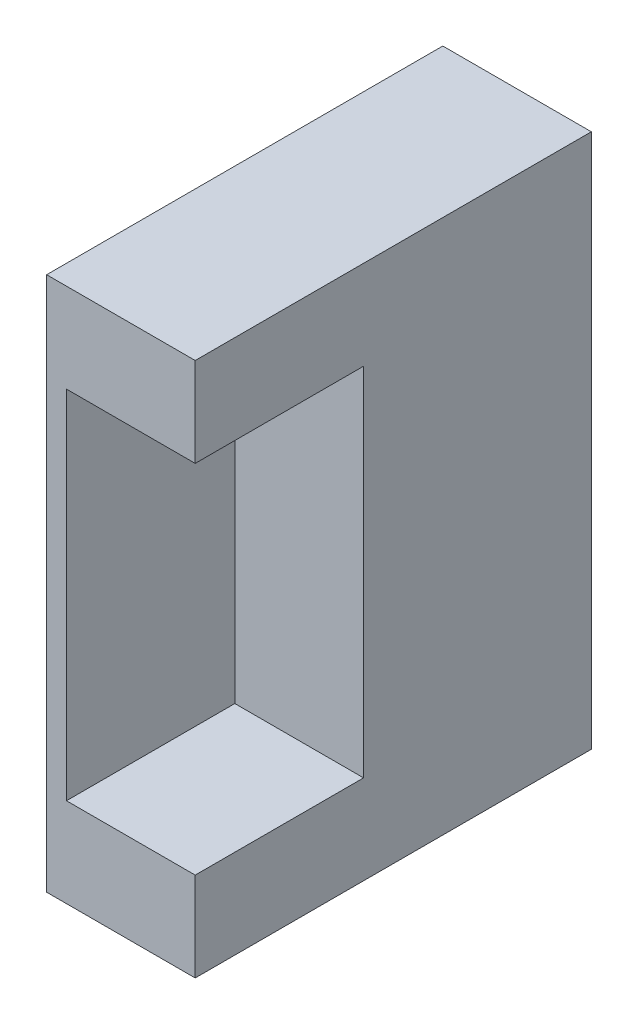
ISO-10303-21;
HEADER;
FILE_DESCRIPTION(('STEP AP214'),'2;1');
FILE_NAME('part.step','',(''),(''),'','','');
FILE_SCHEMA(('AUTOMOTIVE_DESIGN { 1 0 10303 214 1 1 1 1 }'));
ENDSEC;
DATA;
#1=APPLICATION_CONTEXT('core data for automotive mechanical design processes');
#2=APPLICATION_PROTOCOL_DEFINITION('international standard','automotive_design',2000,#1);
#3=PRODUCT_CONTEXT('',#1,'mechanical');
#4=PRODUCT('Part','Part','',(#3));
#5=PRODUCT_RELATED_PRODUCT_CATEGORY('part','',(#4));
#6=PRODUCT_DEFINITION_FORMATION('','',#4);
#7=PRODUCT_DEFINITION_CONTEXT('part definition',#1,'design');
#8=PRODUCT_DEFINITION('design','',#6,#7);
#9=PRODUCT_DEFINITION_SHAPE('','',#8);
#10=(LENGTH_UNIT() NAMED_UNIT(*) SI_UNIT(.MILLI.,.METRE.));
#11=(NAMED_UNIT(*) PLANE_ANGLE_UNIT() SI_UNIT($,.RADIAN.));
#12=(NAMED_UNIT(*) SI_UNIT($,.STERADIAN.) SOLID_ANGLE_UNIT());
#13=UNCERTAINTY_MEASURE_WITH_UNIT(LENGTH_MEASURE(1.E-05),#10,'distance_accuracy_value','');
#14=(GEOMETRIC_REPRESENTATION_CONTEXT(3) GLOBAL_UNCERTAINTY_ASSIGNED_CONTEXT((#13)) GLOBAL_UNIT_ASSIGNED_CONTEXT((#10,
#11,#12)) REPRESENTATION_CONTEXT('',''));
#15=CARTESIAN_POINT('',(0.,0.,0.));
#16=DIRECTION('',(0.,0.,1.));
#17=DIRECTION('',(1.,0.,0.));
#18=AXIS2_PLACEMENT_3D('',#15,#16,#17);
#19=CARTESIAN_POINT('',(19.05,0.,0.));
#20=DIRECTION('',(0.,1.,0.));
#21=DIRECTION('',(0.,0.,1.));
#22=AXIS2_PLACEMENT_3D('',#19,#20,#21);
#23=PLANE('',#22);
#24=DIRECTION('',(0.,0.,-1.));
#25=VECTOR('',#24,1.);
#26=CARTESIAN_POINT('',(0.,0.,0.));
#27=LINE('',#26,#25);
#28=CARTESIAN_POINT('',(0.,0.,50.8));
#29=VERTEX_POINT('',#28);
#30=CARTESIAN_POINT('',(0.,0.,0.));
#31=VERTEX_POINT('',#30);
#32=EDGE_CURVE('E159',#29,#31,#27,.T.);
#33=ORIENTED_EDGE('',*,*,#32,.T.);
#34=DIRECTION('',(-1.,0.,0.));
#35=VECTOR('',#34,1.);
#36=CARTESIAN_POINT('',(19.05,0.,0.));
#37=LINE('',#36,#35);
#38=CARTESIAN_POINT('',(19.05,0.,0.));
#39=VERTEX_POINT('',#38);
#40=EDGE_CURVE('E11',#39,#31,#37,.T.);
#41=ORIENTED_EDGE('',*,*,#40,.F.);
#42=DIRECTION('',(0.,0.,-1.));
#43=VECTOR('',#42,1.);
#44=CARTESIAN_POINT('',(19.05,0.,0.));
#45=LINE('',#44,#43);
#46=CARTESIAN_POINT('',(19.05,0.,50.8));
#47=VERTEX_POINT('',#46);
#48=EDGE_CURVE('E166',#47,#39,#45,.T.);
#49=ORIENTED_EDGE('',*,*,#48,.F.);
#50=DIRECTION('',(-1.,0.,0.));
#51=VECTOR('',#50,1.);
#52=CARTESIAN_POINT('',(19.05,0.,50.8));
#53=LINE('',#52,#51);
#54=EDGE_CURVE('E178',#47,#29,#53,.T.);
#55=ORIENTED_EDGE('',*,*,#54,.T.);
#56=EDGE_LOOP('',(#33,#41,#49,#55));
#57=FACE_BOUND('',#56,.T.);
#58=ADVANCED_FACE('F45',(#57),#23,.F.);
#59=CARTESIAN_POINT('',(19.05,0.,0.));
#60=DIRECTION('',(0.,0.,1.));
#61=DIRECTION('',(1.,0.,0.));
#62=AXIS2_PLACEMENT_3D('',#59,#60,#61);
#63=PLANE('',#62);
#64=DIRECTION('',(0.,1.,0.));
#65=VECTOR('',#64,1.);
#66=CARTESIAN_POINT('',(0.,0.,0.));
#67=LINE('',#66,#65);
#68=CARTESIAN_POINT('',(0.,68.58,0.));
#69=VERTEX_POINT('',#68);
#70=EDGE_CURVE('E182',#31,#69,#67,.T.);
#71=ORIENTED_EDGE('',*,*,#70,.T.);
#72=DIRECTION('',(-1.,0.,0.));
#73=VECTOR('',#72,1.);
#74=CARTESIAN_POINT('',(19.05,68.58,0.));
#75=LINE('',#74,#73);
#76=CARTESIAN_POINT('',(19.05,68.58,0.));
#77=VERTEX_POINT('',#76);
#78=EDGE_CURVE('E53',#77,#69,#75,.T.);
#79=ORIENTED_EDGE('',*,*,#78,.F.);
#80=DIRECTION('',(0.,1.,0.));
#81=VECTOR('',#80,1.);
#82=CARTESIAN_POINT('',(19.05,0.,0.));
#83=LINE('',#82,#81);
#84=EDGE_CURVE('E97',#39,#77,#83,.T.);
#85=ORIENTED_EDGE('',*,*,#84,.F.);
#86=ORIENTED_EDGE('',*,*,#40,.T.);
#87=EDGE_LOOP('',(#71,#79,#85,#86));
#88=FACE_BOUND('',#87,.T.);
#89=ADVANCED_FACE('F224',(#88),#63,.F.);
#90=CARTESIAN_POINT('',(19.05,68.58,0.));
#91=DIRECTION('',(0.,-1.,0.));
#92=DIRECTION('',(0.,0.,-1.));
#93=AXIS2_PLACEMENT_3D('',#90,#91,#92);
#94=PLANE('',#93);
#95=DIRECTION('',(0.,0.,1.));
#96=VECTOR('',#95,1.);
#97=CARTESIAN_POINT('',(0.,68.58,0.));
#98=LINE('',#97,#96);
#99=CARTESIAN_POINT('',(0.,68.58,50.8));
#100=VERTEX_POINT('',#99);
#101=EDGE_CURVE('E185',#69,#100,#98,.T.);
#102=ORIENTED_EDGE('',*,*,#101,.T.);
#103=DIRECTION('',(-1.,0.,0.));
#104=VECTOR('',#103,1.);
#105=CARTESIAN_POINT('',(19.05,68.58,50.8));
#106=LINE('',#105,#104);
#107=CARTESIAN_POINT('',(19.05,68.58,50.8));
#108=VERTEX_POINT('',#107);
#109=EDGE_CURVE('E192',#108,#100,#106,.T.);
#110=ORIENTED_EDGE('',*,*,#109,.F.);
#111=DIRECTION('',(0.,0.,1.));
#112=VECTOR('',#111,1.);
#113=CARTESIAN_POINT('',(19.05,68.58,0.));
#114=LINE('',#113,#112);
#115=EDGE_CURVE('E171',#77,#108,#114,.T.);
#116=ORIENTED_EDGE('',*,*,#115,.F.);
#117=ORIENTED_EDGE('',*,*,#78,.T.);
#118=EDGE_LOOP('',(#102,#110,#116,#117));
#119=FACE_BOUND('',#118,.T.);
#120=ADVANCED_FACE('F199',(#119),#94,.F.);
#121=CARTESIAN_POINT('',(19.05,0.,50.8));
#122=DIRECTION('',(0.,0.,-1.));
#123=DIRECTION('',(-1.,0.,0.));
#124=AXIS2_PLACEMENT_3D('',#121,#122,#123);
#125=PLANE('',#124);
#126=DIRECTION('',(0.,-1.,0.));
#127=VECTOR('',#126,1.);
#128=CARTESIAN_POINT('',(19.05,0.,50.8));
#129=LINE('',#128,#127);
#130=CARTESIAN_POINT('',(19.05,11.43,50.8));
#131=VERTEX_POINT('',#130);
#132=EDGE_CURVE('E68',#131,#47,#129,.T.);
#133=ORIENTED_EDGE('',*,*,#132,.F.);
#134=DIRECTION('',(1.,0.,0.));
#135=VECTOR('',#134,1.);
#136=CARTESIAN_POINT('',(2.54,11.43,50.8));
#137=LINE('',#136,#135);
#138=CARTESIAN_POINT('',(2.54,11.43,50.8));
#139=VERTEX_POINT('',#138);
#140=EDGE_CURVE('E156',#139,#131,#137,.T.);
#141=ORIENTED_EDGE('',*,*,#140,.F.);
#142=DIRECTION('',(0.,-1.,0.));
#143=VECTOR('',#142,1.);
#144=CARTESIAN_POINT('',(2.54,11.43,50.8));
#145=LINE('',#144,#143);
#146=CARTESIAN_POINT('',(2.54,57.15,50.8));
#147=VERTEX_POINT('',#146);
#148=EDGE_CURVE('E127',#147,#139,#145,.T.);
#149=ORIENTED_EDGE('',*,*,#148,.F.);
#150=DIRECTION('',(1.,0.,0.));
#151=VECTOR('',#150,1.);
#152=CARTESIAN_POINT('',(2.54,57.15,50.8));
#153=LINE('',#152,#151);
#154=CARTESIAN_POINT('',(19.05,57.15,50.8));
#155=VERTEX_POINT('',#154);
#156=EDGE_CURVE('E160',#147,#155,#153,.T.);
#157=ORIENTED_EDGE('',*,*,#156,.T.);
#158=EDGE_CURVE('E174',#108,#155,#129,.T.);
#159=ORIENTED_EDGE('',*,*,#158,.F.);
#160=ORIENTED_EDGE('',*,*,#109,.T.);
#161=DIRECTION('',(0.,-1.,0.));
#162=VECTOR('',#161,1.);
#163=CARTESIAN_POINT('',(0.,0.,50.8));
#164=LINE('',#163,#162);
#165=EDGE_CURVE('E90',#100,#29,#164,.T.);
#166=ORIENTED_EDGE('',*,*,#165,.T.);
#167=ORIENTED_EDGE('',*,*,#54,.F.);
#168=EDGE_LOOP('',(#133,#141,#149,#157,#159,#160,#166,#167));
#169=FACE_BOUND('',#168,.T.);
#170=ADVANCED_FACE('F207',(#169),#125,.F.);
#171=CARTESIAN_POINT('',(19.05,0.,0.));
#172=DIRECTION('',(-1.,0.,0.));
#173=DIRECTION('',(0.,0.,1.));
#174=AXIS2_PLACEMENT_3D('',#171,#172,#173);
#175=PLANE('',#174);
#176=DIRECTION('',(0.,1.,0.));
#177=VECTOR('',#176,1.);
#178=CARTESIAN_POINT('',(19.05,11.43,29.21));
#179=LINE('',#178,#177);
#180=CARTESIAN_POINT('',(19.05,11.43,29.21));
#181=VERTEX_POINT('',#180);
#182=CARTESIAN_POINT('',(19.05,57.15,29.21));
#183=VERTEX_POINT('',#182);
#184=EDGE_CURVE('E145',#181,#183,#179,.T.);
#185=ORIENTED_EDGE('',*,*,#184,.F.);
#186=DIRECTION('',(0.,0.,-1.));
#187=VECTOR('',#186,1.);
#188=CARTESIAN_POINT('',(19.05,11.43,50.8));
#189=LINE('',#188,#187);
#190=EDGE_CURVE('E60',#131,#181,#189,.T.);
#191=ORIENTED_EDGE('',*,*,#190,.F.);
#192=ORIENTED_EDGE('',*,*,#132,.T.);
#193=ORIENTED_EDGE('',*,*,#48,.T.);
#194=ORIENTED_EDGE('',*,*,#84,.T.);
#195=ORIENTED_EDGE('',*,*,#115,.T.);
#196=ORIENTED_EDGE('',*,*,#158,.T.);
#197=DIRECTION('',(0.,0.,1.));
#198=VECTOR('',#197,1.);
#199=CARTESIAN_POINT('',(19.05,57.15,50.8));
#200=LINE('',#199,#198);
#201=EDGE_CURVE('E142',#183,#155,#200,.T.);
#202=ORIENTED_EDGE('',*,*,#201,.F.);
#203=EDGE_LOOP('',(#185,#191,#192,#193,#194,#195,#196,#202));
#204=FACE_BOUND('',#203,.T.);
#205=ADVANCED_FACE('F209',(#204),#175,.F.);
#206=CARTESIAN_POINT('',(0.,0.,0.));
#207=DIRECTION('',(-1.,0.,0.));
#208=DIRECTION('',(0.,0.,1.));
#209=AXIS2_PLACEMENT_3D('',#206,#207,#208);
#210=PLANE('',#209);
#211=ORIENTED_EDGE('',*,*,#32,.F.);
#212=ORIENTED_EDGE('',*,*,#165,.F.);
#213=ORIENTED_EDGE('',*,*,#101,.F.);
#214=ORIENTED_EDGE('',*,*,#70,.F.);
#215=EDGE_LOOP('',(#211,#212,#213,#214));
#216=FACE_BOUND('',#215,.T.);
#217=ADVANCED_FACE('F203',(#216),#210,.T.);
#218=CARTESIAN_POINT('',(2.54,11.43,50.8));
#219=DIRECTION('',(0.,-1.,0.));
#220=DIRECTION('',(0.,0.,-1.));
#221=AXIS2_PLACEMENT_3D('',#218,#219,#220);
#222=PLANE('',#221);
#223=ORIENTED_EDGE('',*,*,#190,.T.);
#224=DIRECTION('',(1.,0.,0.));
#225=VECTOR('',#224,1.);
#226=CARTESIAN_POINT('',(2.54,11.43,29.21));
#227=LINE('',#226,#225);
#228=CARTESIAN_POINT('',(2.54,11.43,29.21));
#229=VERTEX_POINT('',#228);
#230=EDGE_CURVE('E116',#229,#181,#227,.T.);
#231=ORIENTED_EDGE('',*,*,#230,.F.);
#232=DIRECTION('',(0.,0.,-1.));
#233=VECTOR('',#232,1.);
#234=CARTESIAN_POINT('',(2.54,11.43,50.8));
#235=LINE('',#234,#233);
#236=EDGE_CURVE('E120',#139,#229,#235,.T.);
#237=ORIENTED_EDGE('',*,*,#236,.F.);
#238=ORIENTED_EDGE('',*,*,#140,.T.);
#239=EDGE_LOOP('',(#223,#231,#237,#238));
#240=FACE_BOUND('',#239,.T.);
#241=ADVANCED_FACE('F118',(#240),#222,.F.);
#242=CARTESIAN_POINT('',(2.54,57.15,50.8));
#243=DIRECTION('',(0.,1.,0.));
#244=DIRECTION('',(0.,0.,1.));
#245=AXIS2_PLACEMENT_3D('',#242,#243,#244);
#246=PLANE('',#245);
#247=ORIENTED_EDGE('',*,*,#201,.T.);
#248=ORIENTED_EDGE('',*,*,#156,.F.);
#249=DIRECTION('',(0.,0.,1.));
#250=VECTOR('',#249,1.);
#251=CARTESIAN_POINT('',(2.54,57.15,50.8));
#252=LINE('',#251,#250);
#253=CARTESIAN_POINT('',(2.54,57.15,29.21));
#254=VERTEX_POINT('',#253);
#255=EDGE_CURVE('E136',#254,#147,#252,.T.);
#256=ORIENTED_EDGE('',*,*,#255,.F.);
#257=DIRECTION('',(1.,0.,0.));
#258=VECTOR('',#257,1.);
#259=CARTESIAN_POINT('',(2.54,57.15,29.21));
#260=LINE('',#259,#258);
#261=EDGE_CURVE('E126',#254,#183,#260,.T.);
#262=ORIENTED_EDGE('',*,*,#261,.T.);
#263=EDGE_LOOP('',(#247,#248,#256,#262));
#264=FACE_BOUND('',#263,.T.);
#265=ADVANCED_FACE('F213',(#264),#246,.F.);
#266=CARTESIAN_POINT('',(2.54,11.43,29.21));
#267=DIRECTION('',(0.,0.,-1.));
#268=DIRECTION('',(-1.,0.,0.));
#269=AXIS2_PLACEMENT_3D('',#266,#267,#268);
#270=PLANE('',#269);
#271=ORIENTED_EDGE('',*,*,#184,.T.);
#272=ORIENTED_EDGE('',*,*,#261,.F.);
#273=DIRECTION('',(0.,1.,0.));
#274=VECTOR('',#273,1.);
#275=CARTESIAN_POINT('',(2.54,11.43,29.21));
#276=LINE('',#275,#274);
#277=EDGE_CURVE('E130',#229,#254,#276,.T.);
#278=ORIENTED_EDGE('',*,*,#277,.F.);
#279=ORIENTED_EDGE('',*,*,#230,.T.);
#280=EDGE_LOOP('',(#271,#272,#278,#279));
#281=FACE_BOUND('',#280,.T.);
#282=ADVANCED_FACE('F131',(#281),#270,.F.);
#283=CARTESIAN_POINT('',(2.54,0.,0.));
#284=DIRECTION('',(1.,0.,0.));
#285=DIRECTION('',(0.,0.,-1.));
#286=AXIS2_PLACEMENT_3D('',#283,#284,#285);
#287=PLANE('',#286);
#288=ORIENTED_EDGE('',*,*,#236,.T.);
#289=ORIENTED_EDGE('',*,*,#277,.T.);
#290=ORIENTED_EDGE('',*,*,#255,.T.);
#291=ORIENTED_EDGE('',*,*,#148,.T.);
#292=EDGE_LOOP('',(#288,#289,#290,#291));
#293=FACE_BOUND('',#292,.T.);
#294=ADVANCED_FACE('F138',(#293),#287,.T.);
#295=CLOSED_SHELL('',(#58,#89,#120,#170,#205,#217,#241,#265,#282,#294));
#296=MANIFOLD_SOLID_BREP('B2',#295);
#297=ADVANCED_BREP_SHAPE_REPRESENTATION('',(#18,#296),#14);
#298=SHAPE_DEFINITION_REPRESENTATION(#9,#297);
ENDSEC;
END-ISO-10303-21;
